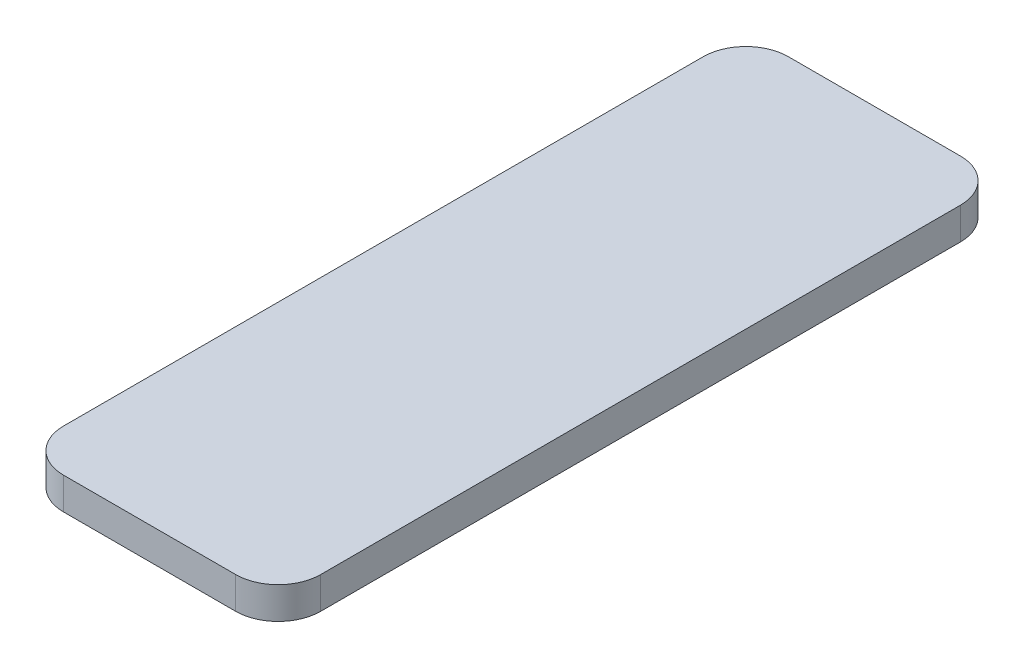
ISO-10303-21;
HEADER;
FILE_DESCRIPTION(('STEP AP214'),'2;1');
FILE_NAME('part.step','',(''),(''),'','','');
FILE_SCHEMA(('AUTOMOTIVE_DESIGN { 1 0 10303 214 1 1 1 1 }'));
ENDSEC;
DATA;
#1=APPLICATION_CONTEXT('core data for automotive mechanical design processes');
#2=APPLICATION_PROTOCOL_DEFINITION('international standard','automotive_design',2000,#1);
#3=PRODUCT_CONTEXT('',#1,'mechanical');
#4=PRODUCT('Part','Part','',(#3));
#5=PRODUCT_RELATED_PRODUCT_CATEGORY('part','',(#4));
#6=PRODUCT_DEFINITION_FORMATION('','',#4);
#7=PRODUCT_DEFINITION_CONTEXT('part definition',#1,'design');
#8=PRODUCT_DEFINITION('design','',#6,#7);
#9=PRODUCT_DEFINITION_SHAPE('','',#8);
#10=(LENGTH_UNIT() NAMED_UNIT(*) SI_UNIT(.MILLI.,.METRE.));
#11=(NAMED_UNIT(*) PLANE_ANGLE_UNIT() SI_UNIT($,.RADIAN.));
#12=(NAMED_UNIT(*) SI_UNIT($,.STERADIAN.) SOLID_ANGLE_UNIT());
#13=UNCERTAINTY_MEASURE_WITH_UNIT(LENGTH_MEASURE(1.E-05),#10,'distance_accuracy_value','');
#14=(GEOMETRIC_REPRESENTATION_CONTEXT(3) GLOBAL_UNCERTAINTY_ASSIGNED_CONTEXT((#13)) GLOBAL_UNIT_ASSIGNED_CONTEXT((#10,
#11,#12)) REPRESENTATION_CONTEXT('',''));
#15=CARTESIAN_POINT('',(0.,0.,0.));
#16=DIRECTION('',(0.,0.,1.));
#17=DIRECTION('',(1.,0.,0.));
#18=AXIS2_PLACEMENT_3D('',#15,#16,#17);
#19=CARTESIAN_POINT('',(27.5,-6.25,-70.25));
#20=DIRECTION('',(-1.,0.,0.));
#21=DIRECTION('',(0.,0.,1.));
#22=AXIS2_PLACEMENT_3D('',#19,#20,#21);
#23=PLANE('',#22);
#24=DIRECTION('',(0.,0.,1.));
#25=VECTOR('',#24,1.);
#26=CARTESIAN_POINT('',(27.5,-3.75,-70.25));
#27=LINE('',#26,#25);
#28=CARTESIAN_POINT('',(27.5,-3.75,-70.25));
#29=VERTEX_POINT('',#28);
#30=CARTESIAN_POINT('',(27.5,-3.75,70.25));
#31=VERTEX_POINT('',#30);
#32=EDGE_CURVE('E12',#29,#31,#27,.T.);
#33=ORIENTED_EDGE('',*,*,#32,.T.);
#34=DIRECTION('',(0.,1.,0.));
#35=VECTOR('',#34,1.);
#36=CARTESIAN_POINT('',(27.5,-6.25,70.25));
#37=LINE('',#36,#35);
#38=CARTESIAN_POINT('',(27.5,-6.25,70.25));
#39=VERTEX_POINT('',#38);
#40=EDGE_CURVE('E127',#39,#31,#37,.T.);
#41=ORIENTED_EDGE('',*,*,#40,.F.);
#42=DIRECTION('',(0.,0.,1.));
#43=VECTOR('',#42,1.);
#44=CARTESIAN_POINT('',(27.5,-6.25,-70.25));
#45=LINE('',#44,#43);
#46=CARTESIAN_POINT('',(27.5,-6.25,-70.25));
#47=VERTEX_POINT('',#46);
#48=EDGE_CURVE('E60',#47,#39,#45,.T.);
#49=ORIENTED_EDGE('',*,*,#48,.F.);
#50=DIRECTION('',(0.,1.,0.));
#51=VECTOR('',#50,1.);
#52=CARTESIAN_POINT('',(27.5,-6.25,-70.25));
#53=LINE('',#52,#51);
#54=EDGE_CURVE('E115',#47,#29,#53,.T.);
#55=ORIENTED_EDGE('',*,*,#54,.T.);
#56=EDGE_LOOP('',(#33,#41,#49,#55));
#57=FACE_BOUND('',#56,.T.);
#58=ADVANCED_FACE('F56',(#57),#23,.F.);
#59=CARTESIAN_POINT('',(25.5,-6.25,70.25));
#60=DIRECTION('',(0.,0.,-1.));
#61=DIRECTION('',(-1.,0.,0.));
#62=AXIS2_PLACEMENT_3D('',#59,#60,#61);
#63=PLANE('',#62);
#64=DIRECTION('',(-1.,0.,0.));
#65=VECTOR('',#64,1.);
#66=CARTESIAN_POINT('',(25.5,-3.75,70.25));
#67=LINE('',#66,#65);
#68=CARTESIAN_POINT('',(25.5,-3.75,70.25));
#69=VERTEX_POINT('',#68);
#70=EDGE_CURVE('E66',#31,#69,#67,.T.);
#71=ORIENTED_EDGE('',*,*,#70,.T.);
#72=DIRECTION('',(0.,1.,0.));
#73=VECTOR('',#72,1.);
#74=CARTESIAN_POINT('',(25.5,-6.25,70.25));
#75=LINE('',#74,#73);
#76=CARTESIAN_POINT('',(25.5,-6.25,70.25));
#77=VERTEX_POINT('',#76);
#78=EDGE_CURVE('E111',#77,#69,#75,.T.);
#79=ORIENTED_EDGE('',*,*,#78,.F.);
#80=DIRECTION('',(-1.,0.,0.));
#81=VECTOR('',#80,1.);
#82=CARTESIAN_POINT('',(25.5,-6.25,70.25));
#83=LINE('',#82,#81);
#84=EDGE_CURVE('E90',#39,#77,#83,.T.);
#85=ORIENTED_EDGE('',*,*,#84,.F.);
#86=ORIENTED_EDGE('',*,*,#40,.T.);
#87=EDGE_LOOP('',(#71,#79,#85,#86));
#88=FACE_BOUND('',#87,.T.);
#89=ADVANCED_FACE('F130',(#88),#63,.F.);
#90=CARTESIAN_POINT('',(25.5,-6.25,-70.25));
#91=DIRECTION('',(1.,0.,0.));
#92=DIRECTION('',(0.,0.,-1.));
#93=AXIS2_PLACEMENT_3D('',#90,#91,#92);
#94=PLANE('',#93);
#95=DIRECTION('',(0.,0.,-1.));
#96=VECTOR('',#95,1.);
#97=CARTESIAN_POINT('',(25.5,-3.75,-70.25));
#98=LINE('',#97,#96);
#99=CARTESIAN_POINT('',(25.5,-3.75,-70.25));
#100=VERTEX_POINT('',#99);
#101=EDGE_CURVE('E106',#69,#100,#98,.T.);
#102=ORIENTED_EDGE('',*,*,#101,.T.);
#103=DIRECTION('',(0.,1.,0.));
#104=VECTOR('',#103,1.);
#105=CARTESIAN_POINT('',(25.5,-6.25,-70.25));
#106=LINE('',#105,#104);
#107=CARTESIAN_POINT('',(25.5,-6.25,-70.25));
#108=VERTEX_POINT('',#107);
#109=EDGE_CURVE('E109',#108,#100,#106,.T.);
#110=ORIENTED_EDGE('',*,*,#109,.F.);
#111=DIRECTION('',(0.,0.,-1.));
#112=VECTOR('',#111,1.);
#113=CARTESIAN_POINT('',(25.5,-6.25,-70.25));
#114=LINE('',#113,#112);
#115=EDGE_CURVE('E123',#77,#108,#114,.T.);
#116=ORIENTED_EDGE('',*,*,#115,.F.);
#117=ORIENTED_EDGE('',*,*,#78,.T.);
#118=EDGE_LOOP('',(#102,#110,#116,#117));
#119=FACE_BOUND('',#118,.T.);
#120=ADVANCED_FACE('F107',(#119),#94,.F.);
#121=CARTESIAN_POINT('',(25.5,-6.25,-70.25));
#122=DIRECTION('',(0.,0.,1.));
#123=DIRECTION('',(1.,0.,0.));
#124=AXIS2_PLACEMENT_3D('',#121,#122,#123);
#125=PLANE('',#124);
#126=DIRECTION('',(1.,0.,0.));
#127=VECTOR('',#126,1.);
#128=CARTESIAN_POINT('',(25.5,-3.75,-70.25));
#129=LINE('',#128,#127);
#130=EDGE_CURVE('E100',#100,#29,#129,.T.);
#131=ORIENTED_EDGE('',*,*,#130,.T.);
#132=ORIENTED_EDGE('',*,*,#54,.F.);
#133=DIRECTION('',(1.,0.,0.));
#134=VECTOR('',#133,1.);
#135=CARTESIAN_POINT('',(25.5,-6.25,-70.25));
#136=LINE('',#135,#134);
#137=EDGE_CURVE('E114',#108,#47,#136,.T.);
#138=ORIENTED_EDGE('',*,*,#137,.F.);
#139=ORIENTED_EDGE('',*,*,#109,.T.);
#140=EDGE_LOOP('',(#131,#132,#138,#139));
#141=FACE_BOUND('',#140,.T.);
#142=ADVANCED_FACE('F113',(#141),#125,.F.);
#143=CARTESIAN_POINT('',(0.,-6.25,0.));
#144=DIRECTION('',(0.,1.,0.));
#145=DIRECTION('',(0.,0.,1.));
#146=AXIS2_PLACEMENT_3D('',#143,#144,#145);
#147=PLANE('',#146);
#148=ORIENTED_EDGE('',*,*,#48,.T.);
#149=ORIENTED_EDGE('',*,*,#84,.T.);
#150=ORIENTED_EDGE('',*,*,#115,.T.);
#151=ORIENTED_EDGE('',*,*,#137,.T.);
#152=EDGE_LOOP('',(#148,#149,#150,#151));
#153=FACE_BOUND('',#152,.T.);
#154=ADVANCED_FACE('F58',(#153),#147,.F.);
#155=CARTESIAN_POINT('',(0.,-3.75,0.));
#156=DIRECTION('',(0.,1.,0.));
#157=DIRECTION('',(0.,0.,1.));
#158=AXIS2_PLACEMENT_3D('',#155,#156,#157);
#159=PLANE('',#158);
#160=ORIENTED_EDGE('',*,*,#32,.F.);
#161=ORIENTED_EDGE('',*,*,#130,.F.);
#162=ORIENTED_EDGE('',*,*,#101,.F.);
#163=ORIENTED_EDGE('',*,*,#70,.F.);
#164=EDGE_LOOP('',(#160,#161,#162,#163));
#165=FACE_BOUND('',#164,.T.);
#166=ADVANCED_FACE('F117',(#165),#159,.T.);
#167=CLOSED_SHELL('',(#58,#89,#120,#142,#154,#166));
#168=MANIFOLD_SOLID_BREP('B2',#167);
#169=CARTESIAN_POINT('',(-27.5,-6.25,-70.25));
#170=DIRECTION('',(1.,0.,0.));
#171=DIRECTION('',(0.,1.,0.));
#172=AXIS2_PLACEMENT_3D('',#169,#170,#171);
#173=PLANE('',#172);
#174=DIRECTION('',(0.,0.,-1.));
#175=VECTOR('',#174,1.);
#176=CARTESIAN_POINT('',(-27.5,-3.75,-70.25));
#177=LINE('',#176,#175);
#178=CARTESIAN_POINT('',(-27.5,-3.75,70.25));
#179=VERTEX_POINT('',#178);
#180=CARTESIAN_POINT('',(-27.5,-3.75,-70.25));
#181=VERTEX_POINT('',#180);
#182=EDGE_CURVE('E252',#179,#181,#177,.T.);
#183=ORIENTED_EDGE('',*,*,#182,.T.);
#184=DIRECTION('',(0.,1.,0.));
#185=VECTOR('',#184,1.);
#186=CARTESIAN_POINT('',(-27.5,-6.25,-70.25));
#187=LINE('',#186,#185);
#188=CARTESIAN_POINT('',(-27.5,-6.25,-70.25));
#189=VERTEX_POINT('',#188);
#190=EDGE_CURVE('E54',#189,#181,#187,.T.);
#191=ORIENTED_EDGE('',*,*,#190,.F.);
#192=DIRECTION('',(0.,0.,-1.));
#193=VECTOR('',#192,1.);
#194=CARTESIAN_POINT('',(-27.5,-6.25,-70.25));
#195=LINE('',#194,#193);
#196=CARTESIAN_POINT('',(-27.5,-6.25,70.25));
#197=VERTEX_POINT('',#196);
#198=EDGE_CURVE('E240',#197,#189,#195,.T.);
#199=ORIENTED_EDGE('',*,*,#198,.F.);
#200=DIRECTION('',(0.,1.,0.));
#201=VECTOR('',#200,1.);
#202=CARTESIAN_POINT('',(-27.5,-6.25,70.25));
#203=LINE('',#202,#201);
#204=EDGE_CURVE('E248',#197,#179,#203,.T.);
#205=ORIENTED_EDGE('',*,*,#204,.T.);
#206=EDGE_LOOP('',(#183,#191,#199,#205));
#207=FACE_BOUND('',#206,.T.);
#208=ADVANCED_FACE('F189',(#207),#173,.F.);
#209=CARTESIAN_POINT('',(-25.5,-6.25,-70.25));
#210=DIRECTION('',(0.,0.,1.));
#211=DIRECTION('',(1.,0.,0.));
#212=AXIS2_PLACEMENT_3D('',#209,#210,#211);
#213=PLANE('',#212);
#214=DIRECTION('',(1.,0.,0.));
#215=VECTOR('',#214,1.);
#216=CARTESIAN_POINT('',(-25.5,-3.75,-70.25));
#217=LINE('',#216,#215);
#218=CARTESIAN_POINT('',(-25.5,-3.75,-70.25));
#219=VERTEX_POINT('',#218);
#220=EDGE_CURVE('E244',#181,#219,#217,.T.);
#221=ORIENTED_EDGE('',*,*,#220,.T.);
#222=DIRECTION('',(0.,1.,0.));
#223=VECTOR('',#222,1.);
#224=CARTESIAN_POINT('',(-25.5,-6.25,-70.25));
#225=LINE('',#224,#223);
#226=CARTESIAN_POINT('',(-25.5,-6.25,-70.25));
#227=VERTEX_POINT('',#226);
#228=EDGE_CURVE('E197',#227,#219,#225,.T.);
#229=ORIENTED_EDGE('',*,*,#228,.F.);
#230=DIRECTION('',(1.,0.,0.));
#231=VECTOR('',#230,1.);
#232=CARTESIAN_POINT('',(-25.5,-6.25,-70.25));
#233=LINE('',#232,#231);
#234=EDGE_CURVE('E235',#189,#227,#233,.T.);
#235=ORIENTED_EDGE('',*,*,#234,.F.);
#236=ORIENTED_EDGE('',*,*,#190,.T.);
#237=EDGE_LOOP('',(#221,#229,#235,#236));
#238=FACE_BOUND('',#237,.T.);
#239=ADVANCED_FACE('F243',(#238),#213,.F.);
#240=CARTESIAN_POINT('',(-25.5,-6.25,-70.25));
#241=DIRECTION('',(-1.,0.,0.));
#242=DIRECTION('',(0.,-1.,0.));
#243=AXIS2_PLACEMENT_3D('',#240,#241,#242);
#244=PLANE('',#243);
#245=DIRECTION('',(0.,0.,1.));
#246=VECTOR('',#245,1.);
#247=CARTESIAN_POINT('',(-25.5,-3.75,-70.25));
#248=LINE('',#247,#246);
#249=CARTESIAN_POINT('',(-25.5,-3.75,70.25));
#250=VERTEX_POINT('',#249);
#251=EDGE_CURVE('E222',#219,#250,#248,.T.);
#252=ORIENTED_EDGE('',*,*,#251,.T.);
#253=DIRECTION('',(0.,1.,0.));
#254=VECTOR('',#253,1.);
#255=CARTESIAN_POINT('',(-25.5,-6.25,70.25));
#256=LINE('',#255,#254);
#257=CARTESIAN_POINT('',(-25.5,-6.25,70.25));
#258=VERTEX_POINT('',#257);
#259=EDGE_CURVE('E245',#258,#250,#256,.T.);
#260=ORIENTED_EDGE('',*,*,#259,.F.);
#261=DIRECTION('',(0.,0.,1.));
#262=VECTOR('',#261,1.);
#263=CARTESIAN_POINT('',(-25.5,-6.25,-70.25));
#264=LINE('',#263,#262);
#265=EDGE_CURVE('E238',#227,#258,#264,.T.);
#266=ORIENTED_EDGE('',*,*,#265,.F.);
#267=ORIENTED_EDGE('',*,*,#228,.T.);
#268=EDGE_LOOP('',(#252,#260,#266,#267));
#269=FACE_BOUND('',#268,.T.);
#270=ADVANCED_FACE('F246',(#269),#244,.F.);
#271=CARTESIAN_POINT('',(-25.5,-6.25,70.25));
#272=DIRECTION('',(0.,0.,-1.));
#273=DIRECTION('',(-1.,0.,0.));
#274=AXIS2_PLACEMENT_3D('',#271,#272,#273);
#275=PLANE('',#274);
#276=DIRECTION('',(-1.,0.,0.));
#277=VECTOR('',#276,1.);
#278=CARTESIAN_POINT('',(-25.5,-3.75,70.25));
#279=LINE('',#278,#277);
#280=EDGE_CURVE('E228',#250,#179,#279,.T.);
#281=ORIENTED_EDGE('',*,*,#280,.T.);
#282=ORIENTED_EDGE('',*,*,#204,.F.);
#283=DIRECTION('',(-1.,0.,0.));
#284=VECTOR('',#283,1.);
#285=CARTESIAN_POINT('',(-25.5,-6.25,70.25));
#286=LINE('',#285,#284);
#287=EDGE_CURVE('E205',#258,#197,#286,.T.);
#288=ORIENTED_EDGE('',*,*,#287,.F.);
#289=ORIENTED_EDGE('',*,*,#259,.T.);
#290=EDGE_LOOP('',(#281,#282,#288,#289));
#291=FACE_BOUND('',#290,.T.);
#292=ADVANCED_FACE('F259',(#291),#275,.F.);
#293=CARTESIAN_POINT('',(0.,-6.25,0.));
#294=DIRECTION('',(0.,-1.,0.));
#295=DIRECTION('',(0.,0.,-1.));
#296=AXIS2_PLACEMENT_3D('',#293,#294,#295);
#297=PLANE('',#296);
#298=ORIENTED_EDGE('',*,*,#198,.T.);
#299=ORIENTED_EDGE('',*,*,#234,.T.);
#300=ORIENTED_EDGE('',*,*,#265,.T.);
#301=ORIENTED_EDGE('',*,*,#287,.T.);
#302=EDGE_LOOP('',(#298,#299,#300,#301));
#303=FACE_BOUND('',#302,.T.);
#304=ADVANCED_FACE('F236',(#303),#297,.T.);
#305=CARTESIAN_POINT('',(0.,-3.75,0.));
#306=DIRECTION('',(0.,-1.,0.));
#307=DIRECTION('',(0.,0.,-1.));
#308=AXIS2_PLACEMENT_3D('',#305,#306,#307);
#309=PLANE('',#308);
#310=ORIENTED_EDGE('',*,*,#182,.F.);
#311=ORIENTED_EDGE('',*,*,#280,.F.);
#312=ORIENTED_EDGE('',*,*,#251,.F.);
#313=ORIENTED_EDGE('',*,*,#220,.F.);
#314=EDGE_LOOP('',(#310,#311,#312,#313));
#315=FACE_BOUND('',#314,.T.);
#316=ADVANCED_FACE('F262',(#315),#309,.F.);
#317=CLOSED_SHELL('',(#208,#239,#270,#292,#304,#316));
#318=MANIFOLD_SOLID_BREP('B6',#317);
#319=CARTESIAN_POINT('',(-30.25,-3.75,85.25));
#320=DIRECTION('',(1.,0.,0.));
#321=DIRECTION('',(0.,0.,-1.));
#322=AXIS2_PLACEMENT_3D('',#319,#320,#321);
#323=PLANE('',#322);
#324=DIRECTION('',(0.,0.,-1.));
#325=VECTOR('',#324,1.);
#326=CARTESIAN_POINT('',(-30.25,-3.75,85.25));
#327=LINE('',#326,#325);
#328=CARTESIAN_POINT('',(-30.25,-3.75,75.25));
#329=VERTEX_POINT('',#328);
#330=CARTESIAN_POINT('',(-30.25,-3.75,-75.25));
#331=VERTEX_POINT('',#330);
#332=EDGE_CURVE('E433',#329,#331,#327,.T.);
#333=ORIENTED_EDGE('',*,*,#332,.F.);
#334=DIRECTION('',(0.,-1.,0.));
#335=VECTOR('',#334,1.);
#336=CARTESIAN_POINT('',(-30.25,3.75,75.25));
#337=LINE('',#336,#335);
#338=CARTESIAN_POINT('',(-30.25,3.75,75.25));
#339=VERTEX_POINT('',#338);
#340=EDGE_CURVE('E385',#329,#339,#337,.F.);
#341=ORIENTED_EDGE('',*,*,#340,.T.);
#342=DIRECTION('',(0.,0.,-1.));
#343=VECTOR('',#342,1.);
#344=CARTESIAN_POINT('',(-30.25,3.75,85.25));
#345=LINE('',#344,#343);
#346=CARTESIAN_POINT('',(-30.25,3.75,-75.25));
#347=VERTEX_POINT('',#346);
#348=EDGE_CURVE('E414',#339,#347,#345,.T.);
#349=ORIENTED_EDGE('',*,*,#348,.T.);
#350=DIRECTION('',(0.,-1.,0.));
#351=VECTOR('',#350,1.);
#352=CARTESIAN_POINT('',(-30.25,-3.75,-75.25));
#353=LINE('',#352,#351);
#354=EDGE_CURVE('E391',#347,#331,#353,.T.);
#355=ORIENTED_EDGE('',*,*,#354,.T.);
#356=EDGE_LOOP('',(#333,#341,#349,#355));
#357=FACE_BOUND('',#356,.T.);
#358=ADVANCED_FACE('F313',(#357),#323,.F.);
#359=CARTESIAN_POINT('',(30.25,-3.75,85.25));
#360=DIRECTION('',(0.,1.,0.));
#361=DIRECTION('',(-1.,0.,0.));
#362=AXIS2_PLACEMENT_3D('',#359,#360,#361);
#363=PLANE('',#362);
#364=DIRECTION('',(1.,0.,0.));
#365=VECTOR('',#364,1.);
#366=CARTESIAN_POINT('',(30.25,-3.75,85.25));
#367=LINE('',#366,#365);
#368=CARTESIAN_POINT('',(-20.25,-3.75,85.25));
#369=VERTEX_POINT('',#368);
#370=CARTESIAN_POINT('',(20.25,-3.75,85.25));
#371=VERTEX_POINT('',#370);
#372=EDGE_CURVE('E399',#369,#371,#367,.T.);
#373=ORIENTED_EDGE('',*,*,#372,.F.);
#374=CARTESIAN_POINT('',(-20.25,-3.75,75.25));
#375=DIRECTION('',(0.,1.,0.));
#376=DIRECTION('',(-1.,0.,0.));
#377=AXIS2_PLACEMENT_3D('',#374,#375,#376);
#378=CIRCLE('',#377,10.);
#379=EDGE_CURVE('E380',#369,#329,#378,.F.);
#380=ORIENTED_EDGE('',*,*,#379,.T.);
#381=ORIENTED_EDGE('',*,*,#332,.T.);
#382=CARTESIAN_POINT('',(-20.25,-3.75,-75.25));
#383=DIRECTION('',(0.,1.,0.));
#384=DIRECTION('',(-1.,0.,0.));
#385=AXIS2_PLACEMENT_3D('',#382,#383,#384);
#386=CIRCLE('',#385,10.);
#387=CARTESIAN_POINT('',(-20.25,-3.75,-85.25));
#388=VERTEX_POINT('',#387);
#389=EDGE_CURVE('E403',#331,#388,#386,.F.);
#390=ORIENTED_EDGE('',*,*,#389,.T.);
#391=DIRECTION('',(1.,0.,0.));
#392=VECTOR('',#391,1.);
#393=CARTESIAN_POINT('',(30.25,-3.75,-85.25));
#394=LINE('',#393,#392);
#395=CARTESIAN_POINT('',(20.25,-3.75,-85.25));
#396=VERTEX_POINT('',#395);
#397=EDGE_CURVE('E417',#388,#396,#394,.T.);
#398=ORIENTED_EDGE('',*,*,#397,.T.);
#399=CARTESIAN_POINT('',(20.25,-3.75,-75.25));
#400=DIRECTION('',(0.,1.,0.));
#401=DIRECTION('',(-1.,0.,0.));
#402=AXIS2_PLACEMENT_3D('',#399,#400,#401);
#403=CIRCLE('',#402,10.);
#404=CARTESIAN_POINT('',(30.25,-3.75,-75.25));
#405=VERTEX_POINT('',#404);
#406=EDGE_CURVE('E440',#396,#405,#403,.F.);
#407=ORIENTED_EDGE('',*,*,#406,.T.);
#408=DIRECTION('',(0.,0.,-1.));
#409=VECTOR('',#408,1.);
#410=CARTESIAN_POINT('',(30.25,-3.75,85.25));
#411=LINE('',#410,#409);
#412=CARTESIAN_POINT('',(30.25,-3.75,75.25));
#413=VERTEX_POINT('',#412);
#414=EDGE_CURVE('E429',#413,#405,#411,.T.);
#415=ORIENTED_EDGE('',*,*,#414,.F.);
#416=CARTESIAN_POINT('',(20.25,-3.75,75.25));
#417=DIRECTION('',(0.,1.,0.));
#418=DIRECTION('',(-1.,0.,0.));
#419=AXIS2_PLACEMENT_3D('',#416,#417,#418);
#420=CIRCLE('',#419,10.);
#421=EDGE_CURVE('E392',#413,#371,#420,.F.);
#422=ORIENTED_EDGE('',*,*,#421,.T.);
#423=EDGE_LOOP('',(#373,#380,#381,#390,#398,#407,#415,#422));
#424=FACE_BOUND('',#423,.T.);
#425=ADVANCED_FACE('F406',(#424),#363,.F.);
#426=CARTESIAN_POINT('',(30.25,-3.75,85.25));
#427=DIRECTION('',(-1.,0.,0.));
#428=DIRECTION('',(0.,0.,1.));
#429=AXIS2_PLACEMENT_3D('',#426,#427,#428);
#430=PLANE('',#429);
#431=DIRECTION('',(0.,0.,-1.));
#432=VECTOR('',#431,1.);
#433=CARTESIAN_POINT('',(30.25,3.75,85.25));
#434=LINE('',#433,#432);
#435=CARTESIAN_POINT('',(30.25,3.75,75.25));
#436=VERTEX_POINT('',#435);
#437=CARTESIAN_POINT('',(30.25,3.75,-75.25));
#438=VERTEX_POINT('',#437);
#439=EDGE_CURVE('E426',#436,#438,#434,.T.);
#440=ORIENTED_EDGE('',*,*,#439,.F.);
#441=DIRECTION('',(0.,1.,0.));
#442=VECTOR('',#441,1.);
#443=CARTESIAN_POINT('',(30.25,-3.75,75.25));
#444=LINE('',#443,#442);
#445=EDGE_CURVE('E463',#436,#413,#444,.F.);
#446=ORIENTED_EDGE('',*,*,#445,.T.);
#447=ORIENTED_EDGE('',*,*,#414,.T.);
#448=DIRECTION('',(0.,1.,0.));
#449=VECTOR('',#448,1.);
#450=CARTESIAN_POINT('',(30.25,-3.75,-75.25));
#451=LINE('',#450,#449);
#452=EDGE_CURVE('E460',#405,#438,#451,.T.);
#453=ORIENTED_EDGE('',*,*,#452,.T.);
#454=EDGE_LOOP('',(#440,#446,#447,#453));
#455=FACE_BOUND('',#454,.T.);
#456=ADVANCED_FACE('F480',(#455),#430,.F.);
#457=CARTESIAN_POINT('',(30.25,3.75,85.25));
#458=DIRECTION('',(0.,-1.,0.));
#459=DIRECTION('',(1.,0.,0.));
#460=AXIS2_PLACEMENT_3D('',#457,#458,#459);
#461=PLANE('',#460);
#462=ORIENTED_EDGE('',*,*,#348,.F.);
#463=CARTESIAN_POINT('',(-20.25,3.75,75.25));
#464=DIRECTION('',(0.,-1.,0.));
#465=DIRECTION('',(1.,0.,0.));
#466=AXIS2_PLACEMENT_3D('',#463,#464,#465);
#467=CIRCLE('',#466,10.);
#468=CARTESIAN_POINT('',(-20.25,3.75,85.25));
#469=VERTEX_POINT('',#468);
#470=EDGE_CURVE('E457',#339,#469,#467,.F.);
#471=ORIENTED_EDGE('',*,*,#470,.T.);
#472=DIRECTION('',(-1.,0.,0.));
#473=VECTOR('',#472,1.);
#474=CARTESIAN_POINT('',(30.25,3.75,85.25));
#475=LINE('',#474,#473);
#476=CARTESIAN_POINT('',(20.25,3.75,85.25));
#477=VERTEX_POINT('',#476);
#478=EDGE_CURVE('E401',#477,#469,#475,.T.);
#479=ORIENTED_EDGE('',*,*,#478,.F.);
#480=CARTESIAN_POINT('',(20.25,3.75,75.25));
#481=DIRECTION('',(0.,-1.,0.));
#482=DIRECTION('',(1.,0.,0.));
#483=AXIS2_PLACEMENT_3D('',#480,#481,#482);
#484=CIRCLE('',#483,10.);
#485=EDGE_CURVE('E337',#477,#436,#484,.F.);
#486=ORIENTED_EDGE('',*,*,#485,.T.);
#487=ORIENTED_EDGE('',*,*,#439,.T.);
#488=CARTESIAN_POINT('',(20.25,3.75,-75.25));
#489=DIRECTION('',(0.,-1.,0.));
#490=DIRECTION('',(1.,0.,0.));
#491=AXIS2_PLACEMENT_3D('',#488,#489,#490);
#492=CIRCLE('',#491,10.);
#493=CARTESIAN_POINT('',(20.25,3.75,-85.25));
#494=VERTEX_POINT('',#493);
#495=EDGE_CURVE('E329',#438,#494,#492,.F.);
#496=ORIENTED_EDGE('',*,*,#495,.T.);
#497=DIRECTION('',(-1.,0.,0.));
#498=VECTOR('',#497,1.);
#499=CARTESIAN_POINT('',(30.25,3.75,-85.25));
#500=LINE('',#499,#498);
#501=CARTESIAN_POINT('',(-20.25,3.75,-85.25));
#502=VERTEX_POINT('',#501);
#503=EDGE_CURVE('E410',#494,#502,#500,.T.);
#504=ORIENTED_EDGE('',*,*,#503,.T.);
#505=CARTESIAN_POINT('',(-20.25,3.75,-75.25));
#506=DIRECTION('',(0.,-1.,0.));
#507=DIRECTION('',(1.,0.,0.));
#508=AXIS2_PLACEMENT_3D('',#505,#506,#507);
#509=CIRCLE('',#508,10.);
#510=EDGE_CURVE('E450',#502,#347,#509,.F.);
#511=ORIENTED_EDGE('',*,*,#510,.T.);
#512=EDGE_LOOP('',(#462,#471,#479,#486,#487,#496,#504,#511));
#513=FACE_BOUND('',#512,.T.);
#514=ADVANCED_FACE('F474',(#513),#461,.F.);
#515=CARTESIAN_POINT('',(0.,0.,85.25));
#516=DIRECTION('',(0.,0.,1.));
#517=DIRECTION('',(1.,0.,0.));
#518=AXIS2_PLACEMENT_3D('',#515,#516,#517);
#519=PLANE('',#518);
#520=ORIENTED_EDGE('',*,*,#478,.T.);
#521=DIRECTION('',(0.,-1.,0.));
#522=VECTOR('',#521,1.);
#523=CARTESIAN_POINT('',(-20.25,-3.75,85.25));
#524=LINE('',#523,#522);
#525=EDGE_CURVE('E384',#469,#369,#524,.T.);
#526=ORIENTED_EDGE('',*,*,#525,.T.);
#527=ORIENTED_EDGE('',*,*,#372,.T.);
#528=DIRECTION('',(0.,1.,0.));
#529=VECTOR('',#528,1.);
#530=CARTESIAN_POINT('',(20.25,3.75,85.25));
#531=LINE('',#530,#529);
#532=EDGE_CURVE('E404',#371,#477,#531,.T.);
#533=ORIENTED_EDGE('',*,*,#532,.T.);
#534=EDGE_LOOP('',(#520,#526,#527,#533));
#535=FACE_BOUND('',#534,.T.);
#536=ADVANCED_FACE('F397',(#535),#519,.T.);
#537=CARTESIAN_POINT('',(0.,0.,-85.25));
#538=DIRECTION('',(0.,0.,1.));
#539=DIRECTION('',(1.,0.,0.));
#540=AXIS2_PLACEMENT_3D('',#537,#538,#539);
#541=PLANE('',#540);
#542=ORIENTED_EDGE('',*,*,#503,.F.);
#543=DIRECTION('',(0.,1.,0.));
#544=VECTOR('',#543,1.);
#545=CARTESIAN_POINT('',(20.25,0.,-85.25));
#546=LINE('',#545,#544);
#547=EDGE_CURVE('E187',#494,#396,#546,.F.);
#548=ORIENTED_EDGE('',*,*,#547,.T.);
#549=ORIENTED_EDGE('',*,*,#397,.F.);
#550=DIRECTION('',(0.,-1.,0.));
#551=VECTOR('',#550,1.);
#552=CARTESIAN_POINT('',(-20.25,0.,-85.25));
#553=LINE('',#552,#551);
#554=EDGE_CURVE('E322',#388,#502,#553,.F.);
#555=ORIENTED_EDGE('',*,*,#554,.T.);
#556=EDGE_LOOP('',(#542,#548,#549,#555));
#557=FACE_BOUND('',#556,.T.);
#558=ADVANCED_FACE('F470',(#557),#541,.F.);
#559=CARTESIAN_POINT('',(-20.25,0.,75.25));
#560=DIRECTION('',(0.,1.,0.));
#561=DIRECTION('',(0.,0.,1.));
#562=AXIS2_PLACEMENT_3D('',#559,#560,#561);
#563=CYLINDRICAL_SURFACE('',#562,10.);
#564=ORIENTED_EDGE('',*,*,#470,.F.);
#565=ORIENTED_EDGE('',*,*,#340,.F.);
#566=ORIENTED_EDGE('',*,*,#379,.F.);
#567=ORIENTED_EDGE('',*,*,#525,.F.);
#568=EDGE_LOOP('',(#564,#565,#566,#567));
#569=FACE_BOUND('',#568,.T.);
#570=ADVANCED_FACE('F383',(#569),#563,.T.);
#571=CARTESIAN_POINT('',(20.25,0.,75.25));
#572=DIRECTION('',(0.,-1.,0.));
#573=DIRECTION('',(0.,0.,-1.));
#574=AXIS2_PLACEMENT_3D('',#571,#572,#573);
#575=CYLINDRICAL_SURFACE('',#574,10.);
#576=ORIENTED_EDGE('',*,*,#421,.F.);
#577=ORIENTED_EDGE('',*,*,#445,.F.);
#578=ORIENTED_EDGE('',*,*,#485,.F.);
#579=ORIENTED_EDGE('',*,*,#532,.F.);
#580=EDGE_LOOP('',(#576,#577,#578,#579));
#581=FACE_BOUND('',#580,.T.);
#582=ADVANCED_FACE('F483',(#581),#575,.T.);
#583=CARTESIAN_POINT('',(20.25,-3.75,-75.25));
#584=DIRECTION('',(0.,1.,0.));
#585=DIRECTION('',(0.,0.,1.));
#586=AXIS2_PLACEMENT_3D('',#583,#584,#585);
#587=CYLINDRICAL_SURFACE('',#586,10.);
#588=ORIENTED_EDGE('',*,*,#406,.F.);
#589=ORIENTED_EDGE('',*,*,#547,.F.);
#590=ORIENTED_EDGE('',*,*,#495,.F.);
#591=ORIENTED_EDGE('',*,*,#452,.F.);
#592=EDGE_LOOP('',(#588,#589,#590,#591));
#593=FACE_BOUND('',#592,.T.);
#594=ADVANCED_FACE('F478',(#593),#587,.T.);
#595=CARTESIAN_POINT('',(-20.25,-3.75,-75.25));
#596=DIRECTION('',(0.,-1.,0.));
#597=DIRECTION('',(0.,0.,-1.));
#598=AXIS2_PLACEMENT_3D('',#595,#596,#597);
#599=CYLINDRICAL_SURFACE('',#598,10.);
#600=ORIENTED_EDGE('',*,*,#510,.F.);
#601=ORIENTED_EDGE('',*,*,#554,.F.);
#602=ORIENTED_EDGE('',*,*,#389,.F.);
#603=ORIENTED_EDGE('',*,*,#354,.F.);
#604=EDGE_LOOP('',(#600,#601,#602,#603));
#605=FACE_BOUND('',#604,.T.);
#606=ADVANCED_FACE('F315',(#605),#599,.T.);
#607=CLOSED_SHELL('',(#358,#425,#456,#514,#536,#558,#570,#582,#594,#606));
#608=MANIFOLD_SOLID_BREP('B48',#607);
#609=ADVANCED_BREP_SHAPE_REPRESENTATION('',(#18,#168,#318,#608),#14);
#610=SHAPE_DEFINITION_REPRESENTATION(#9,#609);
ENDSEC;
END-ISO-10303-21;
